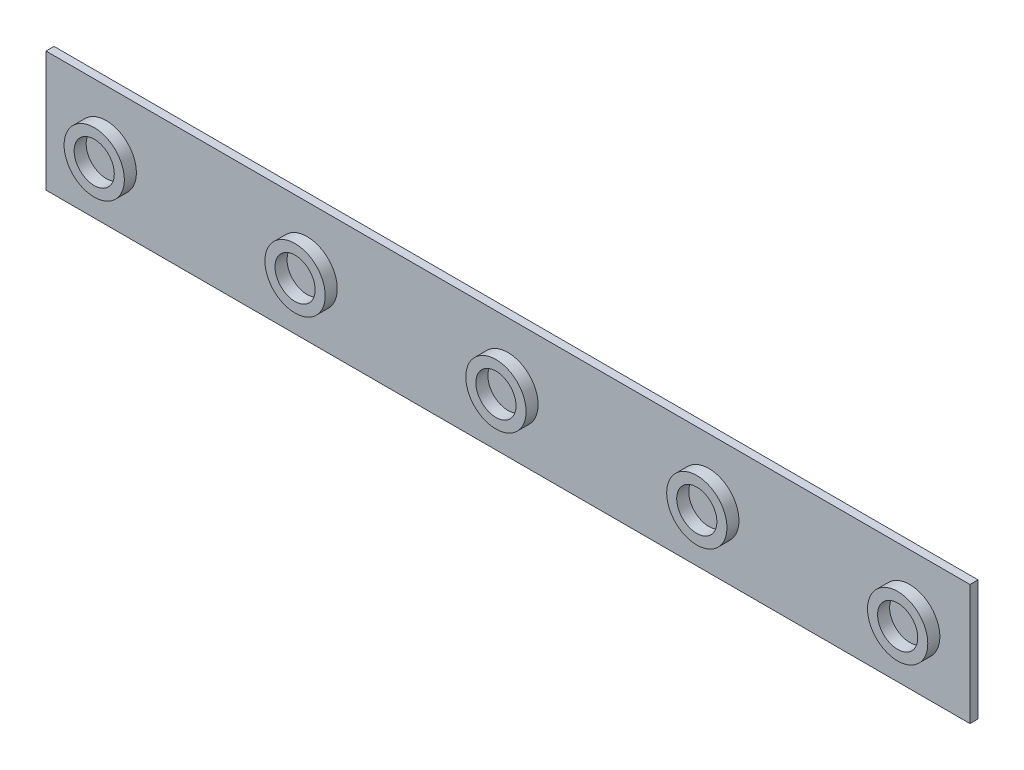
ISO-10303-21;
HEADER;
FILE_DESCRIPTION(('STEP AP214'),'2;1');
FILE_NAME('part.step','',(''),(''),'','','');
FILE_SCHEMA(('AUTOMOTIVE_DESIGN { 1 0 10303 214 1 1 1 1 }'));
ENDSEC;
DATA;
#1=APPLICATION_CONTEXT('core data for automotive mechanical design processes');
#2=APPLICATION_PROTOCOL_DEFINITION('international standard','automotive_design',2000,#1);
#3=PRODUCT_CONTEXT('',#1,'mechanical');
#4=PRODUCT('Part','Part','',(#3));
#5=PRODUCT_RELATED_PRODUCT_CATEGORY('part','',(#4));
#6=PRODUCT_DEFINITION_FORMATION('','',#4);
#7=PRODUCT_DEFINITION_CONTEXT('part definition',#1,'design');
#8=PRODUCT_DEFINITION('design','',#6,#7);
#9=PRODUCT_DEFINITION_SHAPE('','',#8);
#10=(LENGTH_UNIT() NAMED_UNIT(*) SI_UNIT(.MILLI.,.METRE.));
#11=(NAMED_UNIT(*) PLANE_ANGLE_UNIT() SI_UNIT($,.RADIAN.));
#12=(NAMED_UNIT(*) SI_UNIT($,.STERADIAN.) SOLID_ANGLE_UNIT());
#13=UNCERTAINTY_MEASURE_WITH_UNIT(LENGTH_MEASURE(1.E-05),#10,'distance_accuracy_value','');
#14=(GEOMETRIC_REPRESENTATION_CONTEXT(3) GLOBAL_UNCERTAINTY_ASSIGNED_CONTEXT((#13)) GLOBAL_UNIT_ASSIGNED_CONTEXT((#10,
#11,#12)) REPRESENTATION_CONTEXT('',''));
#15=CARTESIAN_POINT('',(0.,0.,0.));
#16=DIRECTION('',(0.,0.,1.));
#17=DIRECTION('',(1.,0.,0.));
#18=AXIS2_PLACEMENT_3D('',#15,#16,#17);
#19=CARTESIAN_POINT('',(0.,0.,2.));
#20=DIRECTION('',(1.,0.,0.));
#21=DIRECTION('',(0.,0.,-1.));
#22=AXIS2_PLACEMENT_3D('',#19,#20,#21);
#23=PLANE('',#22);
#24=DIRECTION('',(0.,-1.,0.));
#25=VECTOR('',#24,1.);
#26=CARTESIAN_POINT('',(0.,0.,0.));
#27=LINE('',#26,#25);
#28=CARTESIAN_POINT('',(0.,30.,0.));
#29=VERTEX_POINT('',#28);
#30=CARTESIAN_POINT('',(0.,0.,0.));
#31=VERTEX_POINT('',#30);
#32=EDGE_CURVE('E110',#29,#31,#27,.T.);
#33=ORIENTED_EDGE('',*,*,#32,.T.);
#34=DIRECTION('',(0.,0.,-1.));
#35=VECTOR('',#34,1.);
#36=CARTESIAN_POINT('',(0.,0.,2.));
#37=LINE('',#36,#35);
#38=CARTESIAN_POINT('',(0.,0.,2.));
#39=VERTEX_POINT('',#38);
#40=EDGE_CURVE('E101',#39,#31,#37,.T.);
#41=ORIENTED_EDGE('',*,*,#40,.F.);
#42=DIRECTION('',(0.,-1.,0.));
#43=VECTOR('',#42,1.);
#44=CARTESIAN_POINT('',(0.,0.,2.));
#45=LINE('',#44,#43);
#46=CARTESIAN_POINT('',(0.,30.,2.));
#47=VERTEX_POINT('',#46);
#48=EDGE_CURVE('E95',#47,#39,#45,.T.);
#49=ORIENTED_EDGE('',*,*,#48,.F.);
#50=DIRECTION('',(0.,0.,-1.));
#51=VECTOR('',#50,1.);
#52=CARTESIAN_POINT('',(0.,30.,2.));
#53=LINE('',#52,#51);
#54=EDGE_CURVE('E106',#47,#29,#53,.T.);
#55=ORIENTED_EDGE('',*,*,#54,.T.);
#56=EDGE_LOOP('',(#33,#41,#49,#55));
#57=FACE_BOUND('',#56,.T.);
#58=ADVANCED_FACE('F43',(#57),#23,.F.);
#59=CARTESIAN_POINT('',(0.,0.,2.));
#60=DIRECTION('',(0.,1.,0.));
#61=DIRECTION('',(0.,0.,1.));
#62=AXIS2_PLACEMENT_3D('',#59,#60,#61);
#63=PLANE('',#62);
#64=DIRECTION('',(1.,0.,0.));
#65=VECTOR('',#64,1.);
#66=CARTESIAN_POINT('',(0.,0.,0.));
#67=LINE('',#66,#65);
#68=CARTESIAN_POINT('',(230.,0.,0.));
#69=VERTEX_POINT('',#68);
#70=EDGE_CURVE('E100',#31,#69,#67,.T.);
#71=ORIENTED_EDGE('',*,*,#70,.T.);
#72=DIRECTION('',(0.,0.,-1.));
#73=VECTOR('',#72,1.);
#74=CARTESIAN_POINT('',(230.,0.,2.));
#75=LINE('',#74,#73);
#76=CARTESIAN_POINT('',(230.,0.,2.));
#77=VERTEX_POINT('',#76);
#78=EDGE_CURVE('E98',#77,#69,#75,.T.);
#79=ORIENTED_EDGE('',*,*,#78,.F.);
#80=DIRECTION('',(1.,0.,0.));
#81=VECTOR('',#80,1.);
#82=CARTESIAN_POINT('',(0.,0.,2.));
#83=LINE('',#82,#81);
#84=EDGE_CURVE('E90',#39,#77,#83,.T.);
#85=ORIENTED_EDGE('',*,*,#84,.F.);
#86=ORIENTED_EDGE('',*,*,#40,.T.);
#87=EDGE_LOOP('',(#71,#79,#85,#86));
#88=FACE_BOUND('',#87,.T.);
#89=ADVANCED_FACE('F99',(#88),#63,.F.);
#90=CARTESIAN_POINT('',(230.,0.,2.));
#91=DIRECTION('',(-1.,0.,0.));
#92=DIRECTION('',(0.,0.,1.));
#93=AXIS2_PLACEMENT_3D('',#90,#91,#92);
#94=PLANE('',#93);
#95=DIRECTION('',(0.,1.,0.));
#96=VECTOR('',#95,1.);
#97=CARTESIAN_POINT('',(230.,0.,0.));
#98=LINE('',#97,#96);
#99=CARTESIAN_POINT('',(230.,30.,0.));
#100=VERTEX_POINT('',#99);
#101=EDGE_CURVE('E76',#69,#100,#98,.T.);
#102=ORIENTED_EDGE('',*,*,#101,.T.);
#103=DIRECTION('',(0.,0.,-1.));
#104=VECTOR('',#103,1.);
#105=CARTESIAN_POINT('',(230.,30.,2.));
#106=LINE('',#105,#104);
#107=CARTESIAN_POINT('',(230.,30.,2.));
#108=VERTEX_POINT('',#107);
#109=EDGE_CURVE('E102',#108,#100,#106,.T.);
#110=ORIENTED_EDGE('',*,*,#109,.F.);
#111=DIRECTION('',(0.,1.,0.));
#112=VECTOR('',#111,1.);
#113=CARTESIAN_POINT('',(230.,0.,2.));
#114=LINE('',#113,#112);
#115=EDGE_CURVE('E93',#77,#108,#114,.T.);
#116=ORIENTED_EDGE('',*,*,#115,.F.);
#117=ORIENTED_EDGE('',*,*,#78,.T.);
#118=EDGE_LOOP('',(#102,#110,#116,#117));
#119=FACE_BOUND('',#118,.T.);
#120=ADVANCED_FACE('F104',(#119),#94,.F.);
#121=CARTESIAN_POINT('',(0.,30.,2.));
#122=DIRECTION('',(0.,-1.,0.));
#123=DIRECTION('',(0.,0.,-1.));
#124=AXIS2_PLACEMENT_3D('',#121,#122,#123);
#125=PLANE('',#124);
#126=DIRECTION('',(-1.,0.,0.));
#127=VECTOR('',#126,1.);
#128=CARTESIAN_POINT('',(0.,30.,0.));
#129=LINE('',#128,#127);
#130=EDGE_CURVE('E82',#100,#29,#129,.T.);
#131=ORIENTED_EDGE('',*,*,#130,.T.);
#132=ORIENTED_EDGE('',*,*,#54,.F.);
#133=DIRECTION('',(-1.,0.,0.));
#134=VECTOR('',#133,1.);
#135=CARTESIAN_POINT('',(0.,30.,2.));
#136=LINE('',#135,#134);
#137=EDGE_CURVE('E59',#108,#47,#136,.T.);
#138=ORIENTED_EDGE('',*,*,#137,.F.);
#139=ORIENTED_EDGE('',*,*,#109,.T.);
#140=EDGE_LOOP('',(#131,#132,#138,#139));
#141=FACE_BOUND('',#140,.T.);
#142=ADVANCED_FACE('F136',(#141),#125,.F.);
#143=CARTESIAN_POINT('',(0.,0.,2.));
#144=DIRECTION('',(0.,0.,-1.));
#145=DIRECTION('',(-1.,0.,0.));
#146=AXIS2_PLACEMENT_3D('',#143,#144,#145);
#147=PLANE('',#146);
#148=CARTESIAN_POINT('',(15.,15.,2.));
#149=DIRECTION('',(0.,0.,-1.));
#150=DIRECTION('',(-1.,0.,0.));
#151=AXIS2_PLACEMENT_3D('',#148,#149,#150);
#152=CIRCLE('',#151,7.5);
#153=CARTESIAN_POINT('',(7.5,15.,2.));
#154=VERTEX_POINT('',#153);
#155=EDGE_CURVE('E11',#154,#154,#152,.F.);
#156=ORIENTED_EDGE('',*,*,#155,.F.);
#157=EDGE_LOOP('',(#156));
#158=FACE_BOUND('',#157,.T.);
#159=CARTESIAN_POINT('',(65.,15.,2.));
#160=DIRECTION('',(0.,0.,-1.));
#161=DIRECTION('',(-1.,0.,0.));
#162=AXIS2_PLACEMENT_3D('',#159,#160,#161);
#163=CIRCLE('',#162,7.50000000000001);
#164=CARTESIAN_POINT('',(57.5,15.,2.));
#165=VERTEX_POINT('',#164);
#166=EDGE_CURVE('E51',#165,#165,#163,.F.);
#167=ORIENTED_EDGE('',*,*,#166,.F.);
#168=EDGE_LOOP('',(#167));
#169=FACE_BOUND('',#168,.T.);
#170=CARTESIAN_POINT('',(115.,15.,2.));
#171=DIRECTION('',(0.,0.,-1.));
#172=DIRECTION('',(-1.,0.,0.));
#173=AXIS2_PLACEMENT_3D('',#170,#171,#172);
#174=CIRCLE('',#173,7.5);
#175=CARTESIAN_POINT('',(107.5,15.,2.));
#176=VERTEX_POINT('',#175);
#177=EDGE_CURVE('E126',#176,#176,#174,.F.);
#178=ORIENTED_EDGE('',*,*,#177,.F.);
#179=EDGE_LOOP('',(#178));
#180=FACE_BOUND('',#179,.T.);
#181=CARTESIAN_POINT('',(165.,15.,2.));
#182=DIRECTION('',(0.,0.,-1.));
#183=DIRECTION('',(-1.,0.,0.));
#184=AXIS2_PLACEMENT_3D('',#181,#182,#183);
#185=CIRCLE('',#184,7.50000000000001);
#186=CARTESIAN_POINT('',(157.5,15.,2.));
#187=VERTEX_POINT('',#186);
#188=EDGE_CURVE('E123',#187,#187,#185,.F.);
#189=ORIENTED_EDGE('',*,*,#188,.F.);
#190=EDGE_LOOP('',(#189));
#191=FACE_BOUND('',#190,.T.);
#192=CARTESIAN_POINT('',(215.,15.,2.));
#193=DIRECTION('',(0.,0.,-1.));
#194=DIRECTION('',(-1.,0.,0.));
#195=AXIS2_PLACEMENT_3D('',#192,#193,#194);
#196=CIRCLE('',#195,7.50000000000001);
#197=CARTESIAN_POINT('',(207.5,15.,2.));
#198=VERTEX_POINT('',#197);
#199=EDGE_CURVE('E120',#198,#198,#196,.F.);
#200=ORIENTED_EDGE('',*,*,#199,.F.);
#201=EDGE_LOOP('',(#200));
#202=FACE_BOUND('',#201,.T.);
#203=ORIENTED_EDGE('',*,*,#48,.T.);
#204=ORIENTED_EDGE('',*,*,#84,.T.);
#205=ORIENTED_EDGE('',*,*,#115,.T.);
#206=ORIENTED_EDGE('',*,*,#137,.T.);
#207=EDGE_LOOP('',(#203,#204,#205,#206));
#208=FACE_BOUND('',#207,.T.);
#209=ADVANCED_FACE('F91',(#158,#169,#180,#191,#202,#208),#147,.F.);
#210=CARTESIAN_POINT('',(0.,0.,0.));
#211=DIRECTION('',(0.,0.,-1.));
#212=DIRECTION('',(-1.,0.,0.));
#213=AXIS2_PLACEMENT_3D('',#210,#211,#212);
#214=PLANE('',#213);
#215=ORIENTED_EDGE('',*,*,#32,.F.);
#216=ORIENTED_EDGE('',*,*,#130,.F.);
#217=ORIENTED_EDGE('',*,*,#101,.F.);
#218=ORIENTED_EDGE('',*,*,#70,.F.);
#219=EDGE_LOOP('',(#215,#216,#217,#218));
#220=FACE_BOUND('',#219,.T.);
#221=ADVANCED_FACE('F135',(#220),#214,.T.);
#222=CARTESIAN_POINT('',(215.,15.,5.));
#223=DIRECTION('',(0.,0.,1.));
#224=DIRECTION('',(1.,0.,0.));
#225=AXIS2_PLACEMENT_3D('',#222,#223,#224);
#226=PLANE('',#225);
#227=CARTESIAN_POINT('',(215.,15.,5.));
#228=DIRECTION('',(0.,0.,1.));
#229=DIRECTION('',(1.,0.,0.));
#230=AXIS2_PLACEMENT_3D('',#227,#228,#229);
#231=CIRCLE('',#230,7.50000000000001);
#232=CARTESIAN_POINT('',(222.5,15.,5.));
#233=VERTEX_POINT('',#232);
#234=EDGE_CURVE('E418',#233,#233,#231,.T.);
#235=ORIENTED_EDGE('',*,*,#234,.T.);
#236=EDGE_LOOP('',(#235));
#237=FACE_BOUND('',#236,.T.);
#238=CARTESIAN_POINT('',(215.,15.,5.));
#239=DIRECTION('',(0.,0.,1.));
#240=DIRECTION('',(1.,0.,0.));
#241=AXIS2_PLACEMENT_3D('',#238,#239,#240);
#242=CIRCLE('',#241,4.99999999999999);
#243=CARTESIAN_POINT('',(220.,15.,5.));
#244=VERTEX_POINT('',#243);
#245=EDGE_CURVE('E421',#244,#244,#242,.T.);
#246=ORIENTED_EDGE('',*,*,#245,.F.);
#247=EDGE_LOOP('',(#246));
#248=FACE_BOUND('',#247,.T.);
#249=ADVANCED_FACE('F150',(#237,#248),#226,.T.);
#250=CARTESIAN_POINT('',(215.,15.,5.));
#251=DIRECTION('',(0.,0.,-1.));
#252=DIRECTION('',(-1.,0.,0.));
#253=AXIS2_PLACEMENT_3D('',#250,#251,#252);
#254=CYLINDRICAL_SURFACE('',#253,7.50000000000001);
#255=ORIENTED_EDGE('',*,*,#234,.F.);
#256=EDGE_LOOP('',(#255));
#257=FACE_BOUND('',#256,.T.);
#258=ORIENTED_EDGE('',*,*,#199,.T.);
#259=EDGE_LOOP('',(#258));
#260=FACE_BOUND('',#259,.T.);
#261=ADVANCED_FACE('F147',(#257,#260),#254,.T.);
#262=CARTESIAN_POINT('',(215.,15.,5.));
#263=DIRECTION('',(0.,0.,-1.));
#264=DIRECTION('',(-1.,0.,0.));
#265=AXIS2_PLACEMENT_3D('',#262,#263,#264);
#266=CYLINDRICAL_SURFACE('',#265,4.99999999999999);
#267=ORIENTED_EDGE('',*,*,#245,.T.);
#268=EDGE_LOOP('',(#267));
#269=FACE_BOUND('',#268,.T.);
#270=CARTESIAN_POINT('',(215.,15.,2.));
#271=DIRECTION('',(0.,0.,1.));
#272=DIRECTION('',(1.,0.,0.));
#273=AXIS2_PLACEMENT_3D('',#270,#271,#272);
#274=CIRCLE('',#273,4.99999999999999);
#275=CARTESIAN_POINT('',(220.,15.,2.));
#276=VERTEX_POINT('',#275);
#277=EDGE_CURVE('E413',#276,#276,#274,.T.);
#278=ORIENTED_EDGE('',*,*,#277,.F.);
#279=EDGE_LOOP('',(#278));
#280=FACE_BOUND('',#279,.T.);
#281=ADVANCED_FACE('F149',(#269,#280),#266,.F.);
#282=CARTESIAN_POINT('',(165.,15.,5.));
#283=DIRECTION('',(0.,0.,1.));
#284=DIRECTION('',(1.,0.,0.));
#285=AXIS2_PLACEMENT_3D('',#282,#283,#284);
#286=PLANE('',#285);
#287=CARTESIAN_POINT('',(165.,15.,5.));
#288=DIRECTION('',(0.,0.,1.));
#289=DIRECTION('',(1.,0.,0.));
#290=AXIS2_PLACEMENT_3D('',#287,#288,#289);
#291=CIRCLE('',#290,7.50000000000001);
#292=CARTESIAN_POINT('',(172.5,15.,5.));
#293=VERTEX_POINT('',#292);
#294=EDGE_CURVE('E409',#293,#293,#291,.T.);
#295=ORIENTED_EDGE('',*,*,#294,.T.);
#296=EDGE_LOOP('',(#295));
#297=FACE_BOUND('',#296,.T.);
#298=CARTESIAN_POINT('',(165.,15.,5.));
#299=DIRECTION('',(0.,0.,1.));
#300=DIRECTION('',(1.,0.,0.));
#301=AXIS2_PLACEMENT_3D('',#298,#299,#300);
#302=CIRCLE('',#301,5.00000000000002);
#303=CARTESIAN_POINT('',(170.,15.,5.));
#304=VERTEX_POINT('',#303);
#305=EDGE_CURVE('E412',#304,#304,#302,.T.);
#306=ORIENTED_EDGE('',*,*,#305,.F.);
#307=EDGE_LOOP('',(#306));
#308=FACE_BOUND('',#307,.T.);
#309=ADVANCED_FACE('F157',(#297,#308),#286,.T.);
#310=CARTESIAN_POINT('',(165.,15.,5.));
#311=DIRECTION('',(0.,0.,-1.));
#312=DIRECTION('',(-1.,0.,0.));
#313=AXIS2_PLACEMENT_3D('',#310,#311,#312);
#314=CYLINDRICAL_SURFACE('',#313,7.50000000000001);
#315=ORIENTED_EDGE('',*,*,#294,.F.);
#316=EDGE_LOOP('',(#315));
#317=FACE_BOUND('',#316,.T.);
#318=ORIENTED_EDGE('',*,*,#188,.T.);
#319=EDGE_LOOP('',(#318));
#320=FACE_BOUND('',#319,.T.);
#321=ADVANCED_FACE('F263',(#317,#320),#314,.T.);
#322=CARTESIAN_POINT('',(165.,15.,5.));
#323=DIRECTION('',(0.,0.,-1.));
#324=DIRECTION('',(-1.,0.,0.));
#325=AXIS2_PLACEMENT_3D('',#322,#323,#324);
#326=CYLINDRICAL_SURFACE('',#325,5.00000000000002);
#327=ORIENTED_EDGE('',*,*,#305,.T.);
#328=EDGE_LOOP('',(#327));
#329=FACE_BOUND('',#328,.T.);
#330=CARTESIAN_POINT('',(165.,15.,2.));
#331=DIRECTION('',(0.,0.,1.));
#332=DIRECTION('',(1.,0.,0.));
#333=AXIS2_PLACEMENT_3D('',#330,#331,#332);
#334=CIRCLE('',#333,5.00000000000002);
#335=CARTESIAN_POINT('',(170.,15.,2.));
#336=VERTEX_POINT('',#335);
#337=EDGE_CURVE('E404',#336,#336,#334,.T.);
#338=ORIENTED_EDGE('',*,*,#337,.F.);
#339=EDGE_LOOP('',(#338));
#340=FACE_BOUND('',#339,.T.);
#341=ADVANCED_FACE('F273',(#329,#340),#326,.F.);
#342=CARTESIAN_POINT('',(115.,15.,5.));
#343=DIRECTION('',(0.,0.,1.));
#344=DIRECTION('',(1.,0.,0.));
#345=AXIS2_PLACEMENT_3D('',#342,#343,#344);
#346=PLANE('',#345);
#347=CARTESIAN_POINT('',(115.,15.,5.));
#348=DIRECTION('',(0.,0.,1.));
#349=DIRECTION('',(1.,0.,0.));
#350=AXIS2_PLACEMENT_3D('',#347,#348,#349);
#351=CIRCLE('',#350,7.5);
#352=CARTESIAN_POINT('',(122.5,15.,5.));
#353=VERTEX_POINT('',#352);
#354=EDGE_CURVE('E400',#353,#353,#351,.T.);
#355=ORIENTED_EDGE('',*,*,#354,.T.);
#356=EDGE_LOOP('',(#355));
#357=FACE_BOUND('',#356,.T.);
#358=CARTESIAN_POINT('',(115.,15.,5.));
#359=DIRECTION('',(0.,0.,1.));
#360=DIRECTION('',(1.,0.,0.));
#361=AXIS2_PLACEMENT_3D('',#358,#359,#360);
#362=CIRCLE('',#361,5.);
#363=CARTESIAN_POINT('',(120.,15.,5.));
#364=VERTEX_POINT('',#363);
#365=EDGE_CURVE('E403',#364,#364,#362,.T.);
#366=ORIENTED_EDGE('',*,*,#365,.F.);
#367=EDGE_LOOP('',(#366));
#368=FACE_BOUND('',#367,.T.);
#369=ADVANCED_FACE('F283',(#357,#368),#346,.T.);
#370=CARTESIAN_POINT('',(115.,15.,5.));
#371=DIRECTION('',(0.,0.,-1.));
#372=DIRECTION('',(-1.,0.,0.));
#373=AXIS2_PLACEMENT_3D('',#370,#371,#372);
#374=CYLINDRICAL_SURFACE('',#373,7.5);
#375=ORIENTED_EDGE('',*,*,#354,.F.);
#376=EDGE_LOOP('',(#375));
#377=FACE_BOUND('',#376,.T.);
#378=ORIENTED_EDGE('',*,*,#177,.T.);
#379=EDGE_LOOP('',(#378));
#380=FACE_BOUND('',#379,.T.);
#381=ADVANCED_FACE('F292',(#377,#380),#374,.T.);
#382=CARTESIAN_POINT('',(115.,15.,5.));
#383=DIRECTION('',(0.,0.,-1.));
#384=DIRECTION('',(-1.,0.,0.));
#385=AXIS2_PLACEMENT_3D('',#382,#383,#384);
#386=CYLINDRICAL_SURFACE('',#385,5.);
#387=ORIENTED_EDGE('',*,*,#365,.T.);
#388=EDGE_LOOP('',(#387));
#389=FACE_BOUND('',#388,.T.);
#390=CARTESIAN_POINT('',(115.,15.,2.));
#391=DIRECTION('',(0.,0.,1.));
#392=DIRECTION('',(1.,0.,0.));
#393=AXIS2_PLACEMENT_3D('',#390,#391,#392);
#394=CIRCLE('',#393,5.);
#395=CARTESIAN_POINT('',(120.,15.,2.));
#396=VERTEX_POINT('',#395);
#397=EDGE_CURVE('E396',#396,#396,#394,.T.);
#398=ORIENTED_EDGE('',*,*,#397,.F.);
#399=EDGE_LOOP('',(#398));
#400=FACE_BOUND('',#399,.T.);
#401=ADVANCED_FACE('F302',(#389,#400),#386,.F.);
#402=CARTESIAN_POINT('',(65.,15.,5.));
#403=DIRECTION('',(0.,0.,1.));
#404=DIRECTION('',(1.,0.,0.));
#405=AXIS2_PLACEMENT_3D('',#402,#403,#404);
#406=PLANE('',#405);
#407=CARTESIAN_POINT('',(65.,15.,5.));
#408=DIRECTION('',(0.,0.,1.));
#409=DIRECTION('',(1.,0.,0.));
#410=AXIS2_PLACEMENT_3D('',#407,#408,#409);
#411=CIRCLE('',#410,7.50000000000001);
#412=CARTESIAN_POINT('',(72.5,15.,5.));
#413=VERTEX_POINT('',#412);
#414=EDGE_CURVE('E394',#413,#413,#411,.T.);
#415=ORIENTED_EDGE('',*,*,#414,.T.);
#416=EDGE_LOOP('',(#415));
#417=FACE_BOUND('',#416,.T.);
#418=CARTESIAN_POINT('',(65.,15.,5.));
#419=DIRECTION('',(0.,0.,1.));
#420=DIRECTION('',(1.,0.,0.));
#421=AXIS2_PLACEMENT_3D('',#418,#419,#420);
#422=CIRCLE('',#421,5.);
#423=CARTESIAN_POINT('',(70.,15.,5.));
#424=VERTEX_POINT('',#423);
#425=EDGE_CURVE('E389',#424,#424,#422,.T.);
#426=ORIENTED_EDGE('',*,*,#425,.F.);
#427=EDGE_LOOP('',(#426));
#428=FACE_BOUND('',#427,.T.);
#429=ADVANCED_FACE('F312',(#417,#428),#406,.T.);
#430=CARTESIAN_POINT('',(65.,15.,5.));
#431=DIRECTION('',(0.,0.,-1.));
#432=DIRECTION('',(-1.,0.,0.));
#433=AXIS2_PLACEMENT_3D('',#430,#431,#432);
#434=CYLINDRICAL_SURFACE('',#433,7.50000000000001);
#435=ORIENTED_EDGE('',*,*,#414,.F.);
#436=EDGE_LOOP('',(#435));
#437=FACE_BOUND('',#436,.T.);
#438=ORIENTED_EDGE('',*,*,#166,.T.);
#439=EDGE_LOOP('',(#438));
#440=FACE_BOUND('',#439,.T.);
#441=ADVANCED_FACE('F131',(#437,#440),#434,.T.);
#442=CARTESIAN_POINT('',(65.,15.,5.));
#443=DIRECTION('',(0.,0.,-1.));
#444=DIRECTION('',(-1.,0.,0.));
#445=AXIS2_PLACEMENT_3D('',#442,#443,#444);
#446=CYLINDRICAL_SURFACE('',#445,5.);
#447=ORIENTED_EDGE('',*,*,#425,.T.);
#448=EDGE_LOOP('',(#447));
#449=FACE_BOUND('',#448,.T.);
#450=CARTESIAN_POINT('',(65.,15.,2.));
#451=DIRECTION('',(0.,0.,1.));
#452=DIRECTION('',(1.,0.,0.));
#453=AXIS2_PLACEMENT_3D('',#450,#451,#452);
#454=CIRCLE('',#453,5.);
#455=CARTESIAN_POINT('',(70.,15.,2.));
#456=VERTEX_POINT('',#455);
#457=EDGE_CURVE('E385',#456,#456,#454,.T.);
#458=ORIENTED_EDGE('',*,*,#457,.F.);
#459=EDGE_LOOP('',(#458));
#460=FACE_BOUND('',#459,.T.);
#461=ADVANCED_FACE('F331',(#449,#460),#446,.F.);
#462=CARTESIAN_POINT('',(15.,15.,5.));
#463=DIRECTION('',(0.,0.,1.));
#464=DIRECTION('',(1.,0.,0.));
#465=AXIS2_PLACEMENT_3D('',#462,#463,#464);
#466=PLANE('',#465);
#467=CARTESIAN_POINT('',(15.,15.,5.));
#468=DIRECTION('',(0.,0.,1.));
#469=DIRECTION('',(1.,0.,0.));
#470=AXIS2_PLACEMENT_3D('',#467,#468,#469);
#471=CIRCLE('',#470,7.5);
#472=CARTESIAN_POINT('',(22.5,15.,5.));
#473=VERTEX_POINT('',#472);
#474=EDGE_CURVE('E113',#473,#473,#471,.T.);
#475=ORIENTED_EDGE('',*,*,#474,.T.);
#476=EDGE_LOOP('',(#475));
#477=FACE_BOUND('',#476,.T.);
#478=CARTESIAN_POINT('',(15.,15.,5.));
#479=DIRECTION('',(0.,0.,1.));
#480=DIRECTION('',(1.,0.,0.));
#481=AXIS2_PLACEMENT_3D('',#478,#479,#480);
#482=CIRCLE('',#481,5.);
#483=CARTESIAN_POINT('',(20.,15.,5.));
#484=VERTEX_POINT('',#483);
#485=EDGE_CURVE('E381',#484,#484,#482,.T.);
#486=ORIENTED_EDGE('',*,*,#485,.F.);
#487=EDGE_LOOP('',(#486));
#488=FACE_BOUND('',#487,.T.);
#489=ADVANCED_FACE('F341',(#477,#488),#466,.T.);
#490=CARTESIAN_POINT('',(15.,15.,5.));
#491=DIRECTION('',(0.,0.,-1.));
#492=DIRECTION('',(-1.,0.,0.));
#493=AXIS2_PLACEMENT_3D('',#490,#491,#492);
#494=CYLINDRICAL_SURFACE('',#493,7.5);
#495=ORIENTED_EDGE('',*,*,#474,.F.);
#496=EDGE_LOOP('',(#495));
#497=FACE_BOUND('',#496,.T.);
#498=ORIENTED_EDGE('',*,*,#155,.T.);
#499=EDGE_LOOP('',(#498));
#500=FACE_BOUND('',#499,.T.);
#501=ADVANCED_FACE('F351',(#497,#500),#494,.T.);
#502=CARTESIAN_POINT('',(15.,15.,5.));
#503=DIRECTION('',(0.,0.,-1.));
#504=DIRECTION('',(-1.,0.,0.));
#505=AXIS2_PLACEMENT_3D('',#502,#503,#504);
#506=CYLINDRICAL_SURFACE('',#505,5.);
#507=ORIENTED_EDGE('',*,*,#485,.T.);
#508=EDGE_LOOP('',(#507));
#509=FACE_BOUND('',#508,.T.);
#510=CARTESIAN_POINT('',(15.,15.,2.));
#511=DIRECTION('',(0.,0.,1.));
#512=DIRECTION('',(1.,0.,0.));
#513=AXIS2_PLACEMENT_3D('',#510,#511,#512);
#514=CIRCLE('',#513,5.);
#515=CARTESIAN_POINT('',(20.,15.,2.));
#516=VERTEX_POINT('',#515);
#517=EDGE_CURVE('E384',#516,#516,#514,.T.);
#518=ORIENTED_EDGE('',*,*,#517,.F.);
#519=EDGE_LOOP('',(#518));
#520=FACE_BOUND('',#519,.T.);
#521=ADVANCED_FACE('F209',(#509,#520),#506,.F.);
#522=ORIENTED_EDGE('',*,*,#277,.T.);
#523=EDGE_LOOP('',(#522));
#524=FACE_BOUND('',#523,.T.);
#525=ADVANCED_FACE('F140',(#524),#147,.F.);
#526=ORIENTED_EDGE('',*,*,#337,.T.);
#527=EDGE_LOOP('',(#526));
#528=FACE_BOUND('',#527,.T.);
#529=ADVANCED_FACE('F208',(#528),#147,.F.);
#530=ORIENTED_EDGE('',*,*,#397,.T.);
#531=EDGE_LOOP('',(#530));
#532=FACE_BOUND('',#531,.T.);
#533=ADVANCED_FACE('F217',(#532),#147,.F.);
#534=ORIENTED_EDGE('',*,*,#457,.T.);
#535=EDGE_LOOP('',(#534));
#536=FACE_BOUND('',#535,.T.);
#537=ADVANCED_FACE('F225',(#536),#147,.F.);
#538=ORIENTED_EDGE('',*,*,#517,.T.);
#539=EDGE_LOOP('',(#538));
#540=FACE_BOUND('',#539,.T.);
#541=ADVANCED_FACE('F139',(#540),#147,.F.);
#542=CLOSED_SHELL('',(#58,#89,#120,#142,#209,#221,#249,#261,#281,#309,#321,#341,#369,#381,#401,
#429,#441,#461,#489,#501,#521,#525,#529,#533,#537,#541));
#543=MANIFOLD_SOLID_BREP('B2',#542);
#544=ADVANCED_BREP_SHAPE_REPRESENTATION('',(#18,#543),#14);
#545=SHAPE_DEFINITION_REPRESENTATION(#9,#544);
ENDSEC;
END-ISO-10303-21;
